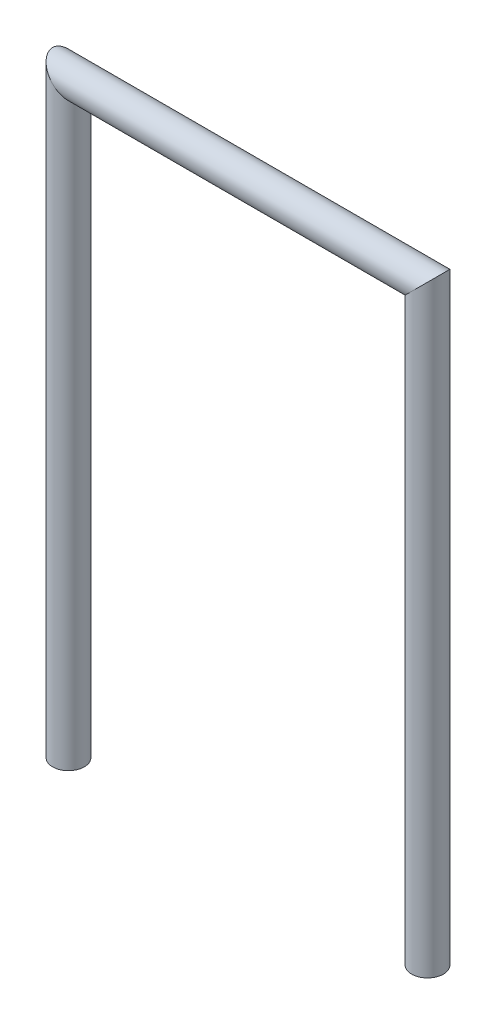
ISO-10303-21;
HEADER;
FILE_DESCRIPTION(('STEP AP214'),'2;1');
FILE_NAME('part.step','',(''),(''),'','','');
FILE_SCHEMA(('AUTOMOTIVE_DESIGN { 1 0 10303 214 1 1 1 1 }'));
ENDSEC;
DATA;
#1=APPLICATION_CONTEXT('core data for automotive mechanical design processes');
#2=APPLICATION_PROTOCOL_DEFINITION('international standard','automotive_design',2000,#1);
#3=PRODUCT_CONTEXT('',#1,'mechanical');
#4=PRODUCT('Part','Part','',(#3));
#5=PRODUCT_RELATED_PRODUCT_CATEGORY('part','',(#4));
#6=PRODUCT_DEFINITION_FORMATION('','',#4);
#7=PRODUCT_DEFINITION_CONTEXT('part definition',#1,'design');
#8=PRODUCT_DEFINITION('design','',#6,#7);
#9=PRODUCT_DEFINITION_SHAPE('','',#8);
#10=(LENGTH_UNIT() NAMED_UNIT(*) SI_UNIT(.MILLI.,.METRE.));
#11=(NAMED_UNIT(*) PLANE_ANGLE_UNIT() SI_UNIT($,.RADIAN.));
#12=(NAMED_UNIT(*) SI_UNIT($,.STERADIAN.) SOLID_ANGLE_UNIT());
#13=UNCERTAINTY_MEASURE_WITH_UNIT(LENGTH_MEASURE(1.E-05),#10,'distance_accuracy_value','');
#14=(GEOMETRIC_REPRESENTATION_CONTEXT(3) GLOBAL_UNCERTAINTY_ASSIGNED_CONTEXT((#13)) GLOBAL_UNIT_ASSIGNED_CONTEXT((#10,
#11,#12)) REPRESENTATION_CONTEXT('',''));
#15=CARTESIAN_POINT('',(0.,0.,0.));
#16=DIRECTION('',(0.,0.,1.));
#17=DIRECTION('',(1.,0.,0.));
#18=AXIS2_PLACEMENT_3D('',#15,#16,#17);
#19=CARTESIAN_POINT('',(340.,560.,0.));
#20=DIRECTION('',(0.,-1.,0.));
#21=DIRECTION('',(0.,0.,-1.));
#22=AXIS2_PLACEMENT_3D('',#19,#20,#21);
#23=CYLINDRICAL_SURFACE('',#22,15.);
#24=CARTESIAN_POINT('',(340.,560.,0.));
#25=DIRECTION('',(0.707106781186548,-0.707106781186548,0.));
#26=DIRECTION('',(0.707106781186548,0.707106781186548,0.));
#27=AXIS2_PLACEMENT_3D('',#24,#25,#26);
#28=ELLIPSE('',#27,21.2132034355964,15.);
#29=CARTESIAN_POINT('',(355.,575.,0.));
#30=VERTEX_POINT('',#29);
#31=EDGE_CURVE('E38',#30,#30,#28,.F.);
#32=ORIENTED_EDGE('',*,*,#31,.F.);
#33=EDGE_LOOP('',(#32));
#34=FACE_BOUND('',#33,.T.);
#35=CARTESIAN_POINT('',(340.,0.,0.));
#36=DIRECTION('',(0.,-1.,0.));
#37=DIRECTION('',(0.,0.,-1.));
#38=AXIS2_PLACEMENT_3D('',#35,#36,#37);
#39=CIRCLE('',#38,15.);
#40=CARTESIAN_POINT('',(340.,0.,-15.));
#41=VERTEX_POINT('',#40);
#42=EDGE_CURVE('E11',#41,#41,#39,.T.);
#43=ORIENTED_EDGE('',*,*,#42,.F.);
#44=EDGE_LOOP('',(#43));
#45=FACE_BOUND('',#44,.T.);
#46=ADVANCED_FACE('F32',(#34,#45),#23,.T.);
#47=CARTESIAN_POINT('',(0.,560.,0.));
#48=DIRECTION('',(1.,0.,0.));
#49=DIRECTION('',(0.,0.,-1.));
#50=AXIS2_PLACEMENT_3D('',#47,#48,#49);
#51=CYLINDRICAL_SURFACE('',#50,15.);
#52=CARTESIAN_POINT('',(0.,560.,0.));
#53=DIRECTION('',(0.707106781186548,0.707106781186548,0.));
#54=DIRECTION('',(0.707106781186548,-0.707106781186548,0.));
#55=AXIS2_PLACEMENT_3D('',#52,#53,#54);
#56=ELLIPSE('',#55,21.2132034355964,15.);
#57=CARTESIAN_POINT('',(15.,545.,0.));
#58=VERTEX_POINT('',#57);
#59=EDGE_CURVE('E42',#58,#58,#56,.T.);
#60=ORIENTED_EDGE('',*,*,#59,.T.);
#61=EDGE_LOOP('',(#60));
#62=FACE_BOUND('',#61,.T.);
#63=ORIENTED_EDGE('',*,*,#31,.T.);
#64=EDGE_LOOP('',(#63));
#65=FACE_BOUND('',#64,.T.);
#66=ADVANCED_FACE('F64',(#62,#65),#51,.T.);
#67=CARTESIAN_POINT('',(0.,602.426406871193,0.));
#68=DIRECTION('',(0.,-1.,0.));
#69=DIRECTION('',(0.,0.,-1.));
#70=AXIS2_PLACEMENT_3D('',#67,#68,#69);
#71=CYLINDRICAL_SURFACE('',#70,15.);
#72=CARTESIAN_POINT('',(0.,0.,0.));
#73=DIRECTION('',(0.,1.,0.));
#74=DIRECTION('',(0.,0.,1.));
#75=AXIS2_PLACEMENT_3D('',#72,#73,#74);
#76=CIRCLE('',#75,15.);
#77=CARTESIAN_POINT('',(0.,0.,15.));
#78=VERTEX_POINT('',#77);
#79=EDGE_CURVE('E46',#78,#78,#76,.T.);
#80=ORIENTED_EDGE('',*,*,#79,.T.);
#81=EDGE_LOOP('',(#80));
#82=FACE_BOUND('',#81,.T.);
#83=ORIENTED_EDGE('',*,*,#59,.F.);
#84=EDGE_LOOP('',(#83));
#85=FACE_BOUND('',#84,.T.);
#86=ADVANCED_FACE('F52',(#82,#85),#71,.T.);
#87=CARTESIAN_POINT('',(0.,0.,0.));
#88=DIRECTION('',(0.,1.,0.));
#89=DIRECTION('',(0.,0.,1.));
#90=AXIS2_PLACEMENT_3D('',#87,#88,#89);
#91=PLANE('',#90);
#92=ORIENTED_EDGE('',*,*,#79,.F.);
#93=EDGE_LOOP('',(#92));
#94=FACE_BOUND('',#93,.T.);
#95=ADVANCED_FACE('F55',(#94),#91,.F.);
#96=CARTESIAN_POINT('',(340.,0.,0.));
#97=DIRECTION('',(0.,-1.,0.));
#98=DIRECTION('',(0.,0.,-1.));
#99=AXIS2_PLACEMENT_3D('',#96,#97,#98);
#100=PLANE('',#99);
#101=ORIENTED_EDGE('',*,*,#42,.T.);
#102=EDGE_LOOP('',(#101));
#103=FACE_BOUND('',#102,.T.);
#104=ADVANCED_FACE('F57',(#103),#100,.T.);
#105=CLOSED_SHELL('',(#46,#66,#86,#95,#104));
#106=MANIFOLD_SOLID_BREP('B2',#105);
#107=ADVANCED_BREP_SHAPE_REPRESENTATION('',(#18,#106),#14);
#108=SHAPE_DEFINITION_REPRESENTATION(#9,#107);
ENDSEC;
END-ISO-10303-21;
